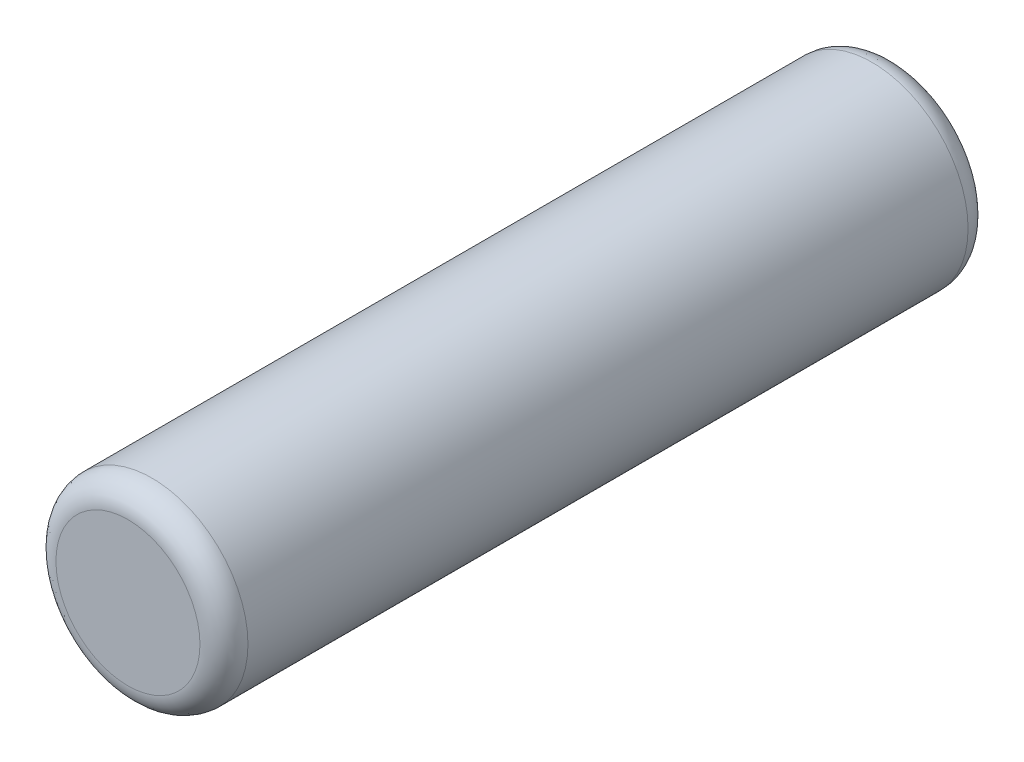
ISO-10303-21;
HEADER;
FILE_DESCRIPTION(('STEP AP214'),'2;1');
FILE_NAME('part.step','',(''),(''),'','','');
FILE_SCHEMA(('AUTOMOTIVE_DESIGN { 1 0 10303 214 1 1 1 1 }'));
ENDSEC;
DATA;
#1=APPLICATION_CONTEXT('core data for automotive mechanical design processes');
#2=APPLICATION_PROTOCOL_DEFINITION('international standard','automotive_design',2000,#1);
#3=PRODUCT_CONTEXT('',#1,'mechanical');
#4=PRODUCT('Part','Part','',(#3));
#5=PRODUCT_RELATED_PRODUCT_CATEGORY('part','',(#4));
#6=PRODUCT_DEFINITION_FORMATION('','',#4);
#7=PRODUCT_DEFINITION_CONTEXT('part definition',#1,'design');
#8=PRODUCT_DEFINITION('design','',#6,#7);
#9=PRODUCT_DEFINITION_SHAPE('','',#8);
#10=(LENGTH_UNIT() NAMED_UNIT(*) SI_UNIT(.MILLI.,.METRE.));
#11=(NAMED_UNIT(*) PLANE_ANGLE_UNIT() SI_UNIT($,.RADIAN.));
#12=(NAMED_UNIT(*) SI_UNIT($,.STERADIAN.) SOLID_ANGLE_UNIT());
#13=UNCERTAINTY_MEASURE_WITH_UNIT(LENGTH_MEASURE(1.E-05),#10,'distance_accuracy_value','');
#14=(GEOMETRIC_REPRESENTATION_CONTEXT(3) GLOBAL_UNCERTAINTY_ASSIGNED_CONTEXT((#13)) GLOBAL_UNIT_ASSIGNED_CONTEXT((#10,
#11,#12)) REPRESENTATION_CONTEXT('',''));
#15=CARTESIAN_POINT('',(0.,0.,0.));
#16=DIRECTION('',(0.,0.,1.));
#17=DIRECTION('',(1.,0.,0.));
#18=AXIS2_PLACEMENT_3D('',#15,#16,#17);
#19=CARTESIAN_POINT('',(0.,0.,16.));
#20=DIRECTION('',(0.,0.,1.));
#21=DIRECTION('',(1.,0.,0.));
#22=AXIS2_PLACEMENT_3D('',#19,#20,#21);
#23=PLANE('',#22);
#24=CARTESIAN_POINT('',(0.,0.,16.));
#25=DIRECTION('',(0.,0.,-1.));
#26=DIRECTION('',(-1.,0.,0.));
#27=AXIS2_PLACEMENT_3D('',#24,#25,#26);
#28=CIRCLE('',#27,1.50000000000001);
#29=CARTESIAN_POINT('',(-1.5,0.,16.));
#30=VERTEX_POINT('',#29);
#31=CARTESIAN_POINT('',(1.5,0.,16.));
#32=VERTEX_POINT('',#31);
#33=EDGE_CURVE('E50',#30,#32,#28,.T.);
#34=ORIENTED_EDGE('',*,*,#33,.F.);
#35=CARTESIAN_POINT('',(0.,0.,16.));
#36=DIRECTION('',(0.,0.,-1.));
#37=DIRECTION('',(1.,0.,0.));
#38=AXIS2_PLACEMENT_3D('',#35,#36,#37);
#39=CIRCLE('',#38,1.50000000000001);
#40=EDGE_CURVE('E45',#32,#30,#39,.T.);
#41=ORIENTED_EDGE('',*,*,#40,.F.);
#42=EDGE_LOOP('',(#34,#41));
#43=FACE_BOUND('',#42,.T.);
#44=ADVANCED_FACE('F16',(#43),#23,.T.);
#45=CARTESIAN_POINT('',(1.50000000000001,0.,16.));
#46=CARTESIAN_POINT('',(1.79289321881346,0.,16.));
#47=CARTESIAN_POINT('',(2.,0.,15.7928932188134));
#48=CARTESIAN_POINT('',(2.,0.,15.5));
#49=(BOUNDED_CURVE() B_SPLINE_CURVE(3,(#45,#46,#47,#48),.UNSPECIFIED.,.F.,
.F.) B_SPLINE_CURVE_WITH_KNOTS((4,4),(0.,1.),
.UNSPECIFIED.) CURVE() GEOMETRIC_REPRESENTATION_ITEM() RATIONAL_B_SPLINE_CURVE((1.,
0.804737854124365,0.804737854124365,1.)) REPRESENTATION_ITEM(''));
#50=CARTESIAN_POINT('',(0.,0.,15.5));
#51=DIRECTION('',(0.,0.,1.));
#52=AXIS1_PLACEMENT('',#50,#51);
#53=SURFACE_OF_REVOLUTION('',#49,#52);
#54=ORIENTED_EDGE('',*,*,#40,.T.);
#55=ORIENTED_EDGE('',*,*,#33,.T.);
#56=EDGE_LOOP('',(#54,#55));
#57=FACE_BOUND('',#56,.T.);
#58=CARTESIAN_POINT('',(0.,0.,15.5));
#59=DIRECTION('',(0.,0.,-1.));
#60=DIRECTION('',(-1.,0.,0.));
#61=AXIS2_PLACEMENT_3D('',#58,#59,#60);
#62=CIRCLE('',#61,2.);
#63=CARTESIAN_POINT('',(-2.,0.,15.5));
#64=VERTEX_POINT('',#63);
#65=EDGE_CURVE('E63',#64,#64,#62,.T.);
#66=ORIENTED_EDGE('',*,*,#65,.F.);
#67=EDGE_LOOP('',(#66));
#68=FACE_BOUND('',#67,.T.);
#69=ADVANCED_FACE('F55',(#57,#68),#53,.F.);
#70=CARTESIAN_POINT('',(0.,0.,0.));
#71=DIRECTION('',(0.,0.,1.));
#72=DIRECTION('',(1.,0.,0.));
#73=AXIS2_PLACEMENT_3D('',#70,#71,#72);
#74=PLANE('',#73);
#75=CARTESIAN_POINT('',(0.,0.,0.));
#76=DIRECTION('',(0.,0.,1.));
#77=DIRECTION('',(-1.,0.,0.));
#78=AXIS2_PLACEMENT_3D('',#75,#76,#77);
#79=CIRCLE('',#78,1.5);
#80=CARTESIAN_POINT('',(1.5,0.,0.));
#81=VERTEX_POINT('',#80);
#82=CARTESIAN_POINT('',(-1.5,0.,0.));
#83=VERTEX_POINT('',#82);
#84=EDGE_CURVE('E36',#81,#83,#79,.F.);
#85=ORIENTED_EDGE('',*,*,#84,.T.);
#86=CARTESIAN_POINT('',(0.,0.,0.));
#87=DIRECTION('',(0.,0.,1.));
#88=DIRECTION('',(1.,0.,0.));
#89=AXIS2_PLACEMENT_3D('',#86,#87,#88);
#90=CIRCLE('',#89,1.5);
#91=EDGE_CURVE('E28',#81,#83,#90,.T.);
#92=ORIENTED_EDGE('',*,*,#91,.F.);
#93=EDGE_LOOP('',(#85,#92));
#94=FACE_BOUND('',#93,.T.);
#95=ADVANCED_FACE('F73',(#94),#74,.F.);
#96=CARTESIAN_POINT('',(0.,0.,0.5));
#97=DIRECTION('',(0.,0.,-1.));
#98=DIRECTION('',(-1.,0.,0.));
#99=AXIS2_PLACEMENT_3D('',#96,#97,#98);
#100=CYLINDRICAL_SURFACE('',#99,2.);
#101=CARTESIAN_POINT('',(0.,0.,0.5));
#102=DIRECTION('',(0.,0.,1.));
#103=DIRECTION('',(1.,0.,0.));
#104=AXIS2_PLACEMENT_3D('',#101,#102,#103);
#105=CIRCLE('',#104,2.);
#106=CARTESIAN_POINT('',(2.,0.,0.5));
#107=VERTEX_POINT('',#106);
#108=EDGE_CURVE('E10',#107,#107,#105,.F.);
#109=ORIENTED_EDGE('',*,*,#108,.F.);
#110=EDGE_LOOP('',(#109));
#111=FACE_BOUND('',#110,.T.);
#112=ORIENTED_EDGE('',*,*,#65,.T.);
#113=EDGE_LOOP('',(#112));
#114=FACE_BOUND('',#113,.T.);
#115=ADVANCED_FACE('F104',(#111,#114),#100,.T.);
#116=CARTESIAN_POINT('',(2.,0.,0.5));
#117=CARTESIAN_POINT('',(2.,0.,0.207106781186547));
#118=CARTESIAN_POINT('',(1.79289321881345,0.,0.));
#119=CARTESIAN_POINT('',(1.5,0.,0.));
#120=(BOUNDED_CURVE() B_SPLINE_CURVE(3,(#116,#117,#118,#119),.UNSPECIFIED.,.F.,
.F.) B_SPLINE_CURVE_WITH_KNOTS((4,4),(0.,1.),
.UNSPECIFIED.) CURVE() GEOMETRIC_REPRESENTATION_ITEM() RATIONAL_B_SPLINE_CURVE((1.,
0.804737854124365,0.804737854124365,1.)) REPRESENTATION_ITEM(''));
#121=CARTESIAN_POINT('',(0.,0.,0.5));
#122=DIRECTION('',(0.,0.,1.));
#123=AXIS1_PLACEMENT('',#121,#122);
#124=SURFACE_OF_REVOLUTION('',#120,#123);
#125=ORIENTED_EDGE('',*,*,#91,.T.);
#126=ORIENTED_EDGE('',*,*,#84,.F.);
#127=EDGE_LOOP('',(#125,#126));
#128=FACE_BOUND('',#127,.T.);
#129=ORIENTED_EDGE('',*,*,#108,.T.);
#130=EDGE_LOOP('',(#129));
#131=FACE_BOUND('',#130,.T.);
#132=ADVANCED_FACE('F95',(#128,#131),#124,.F.);
#133=CLOSED_SHELL('',(#44,#69,#95,#115,#132));
#134=MANIFOLD_SOLID_BREP('B1',#133);
#135=ADVANCED_BREP_SHAPE_REPRESENTATION('',(#18,#134),#14);
#136=SHAPE_DEFINITION_REPRESENTATION(#9,#135);
ENDSEC;
END-ISO-10303-21;
